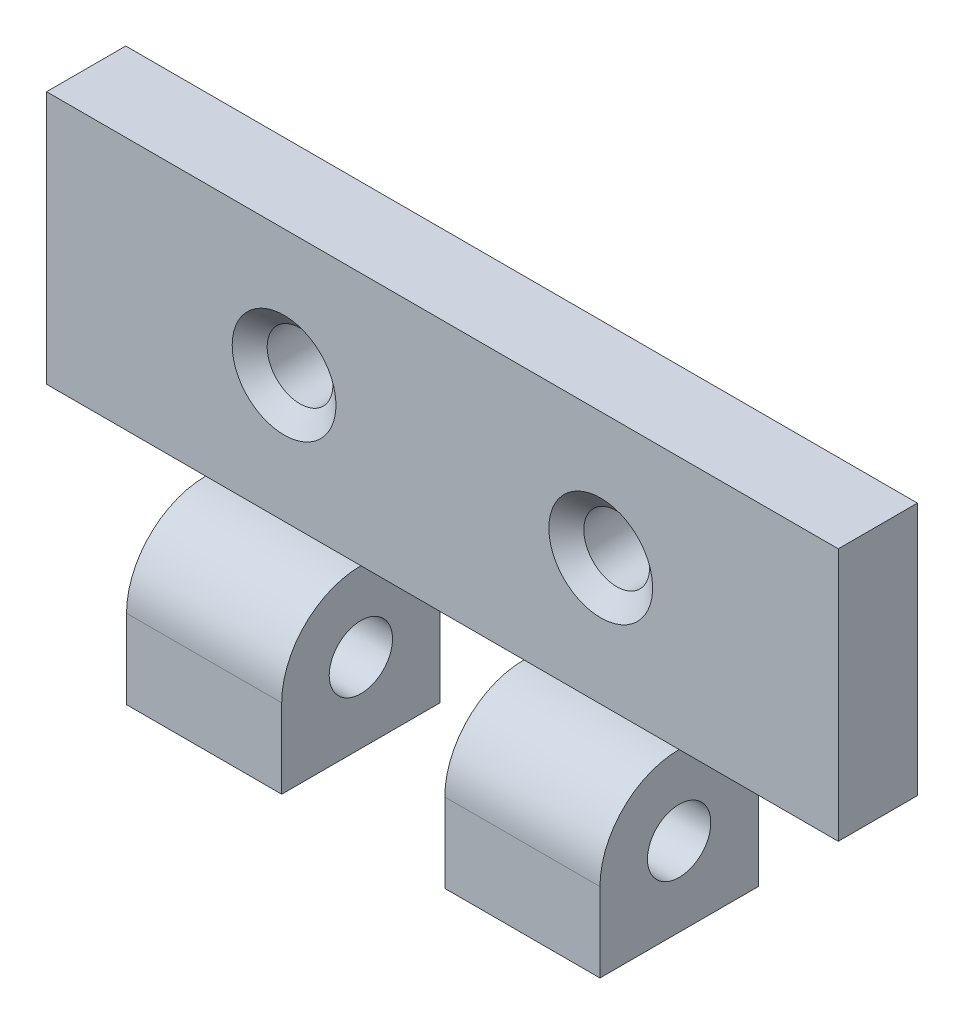
ISO-10303-21;
HEADER;
FILE_DESCRIPTION(('STEP AP214'),'2;1');
FILE_NAME('part.step','',(''),(''),'','','');
FILE_SCHEMA(('AUTOMOTIVE_DESIGN { 1 0 10303 214 1 1 1 1 }'));
ENDSEC;
DATA;
#1=APPLICATION_CONTEXT('core data for automotive mechanical design processes');
#2=APPLICATION_PROTOCOL_DEFINITION('international standard','automotive_design',2000,#1);
#3=PRODUCT_CONTEXT('',#1,'mechanical');
#4=PRODUCT('Part','Part','',(#3));
#5=PRODUCT_RELATED_PRODUCT_CATEGORY('part','',(#4));
#6=PRODUCT_DEFINITION_FORMATION('','',#4);
#7=PRODUCT_DEFINITION_CONTEXT('part definition',#1,'design');
#8=PRODUCT_DEFINITION('design','',#6,#7);
#9=PRODUCT_DEFINITION_SHAPE('','',#8);
#10=(LENGTH_UNIT() NAMED_UNIT(*) SI_UNIT(.MILLI.,.METRE.));
#11=(NAMED_UNIT(*) PLANE_ANGLE_UNIT() SI_UNIT($,.RADIAN.));
#12=(NAMED_UNIT(*) SI_UNIT($,.STERADIAN.) SOLID_ANGLE_UNIT());
#13=UNCERTAINTY_MEASURE_WITH_UNIT(LENGTH_MEASURE(1.E-05),#10,'distance_accuracy_value','');
#14=(GEOMETRIC_REPRESENTATION_CONTEXT(3) GLOBAL_UNCERTAINTY_ASSIGNED_CONTEXT((#13)) GLOBAL_UNIT_ASSIGNED_CONTEXT((#10,
#11,#12)) REPRESENTATION_CONTEXT('',''));
#15=CARTESIAN_POINT('',(0.,0.,0.));
#16=DIRECTION('',(0.,0.,1.));
#17=DIRECTION('',(1.,0.,0.));
#18=AXIS2_PLACEMENT_3D('',#15,#16,#17);
#19=CARTESIAN_POINT('',(-114.95,0.,-190.));
#20=DIRECTION('',(1.,0.,0.));
#21=DIRECTION('',(0.,0.,-1.));
#22=AXIS2_PLACEMENT_3D('',#19,#20,#21);
#23=PLANE('',#22);
#24=CARTESIAN_POINT('',(-114.95,5.,-195.));
#25=DIRECTION('',(-1.,0.,0.));
#26=DIRECTION('',(0.,0.,1.));
#27=AXIS2_PLACEMENT_3D('',#24,#25,#26);
#28=CIRCLE('',#27,2.);
#29=CARTESIAN_POINT('',(-114.95,5.,-193.));
#30=VERTEX_POINT('',#29);
#31=EDGE_CURVE('E208',#30,#30,#28,.T.);
#32=ORIENTED_EDGE('',*,*,#31,.F.);
#33=EDGE_LOOP('',(#32));
#34=FACE_BOUND('',#33,.T.);
#35=DIRECTION('',(0.,-1.,0.));
#36=VECTOR('',#35,1.);
#37=CARTESIAN_POINT('',(-114.95,0.,-190.));
#38=LINE('',#37,#36);
#39=CARTESIAN_POINT('',(-114.95,5.00000000000002,-190.));
#40=VERTEX_POINT('',#39);
#41=CARTESIAN_POINT('',(-114.95,0.,-190.));
#42=VERTEX_POINT('',#41);
#43=EDGE_CURVE('E119',#40,#42,#38,.T.);
#44=ORIENTED_EDGE('',*,*,#43,.F.);
#45=CARTESIAN_POINT('',(-114.95,5.,-195.));
#46=DIRECTION('',(1.,0.,0.));
#47=DIRECTION('',(0.,0.,-1.));
#48=AXIS2_PLACEMENT_3D('',#45,#46,#47);
#49=CIRCLE('',#48,5.);
#50=CARTESIAN_POINT('',(-114.95,9.99999999999999,-195.));
#51=VERTEX_POINT('',#50);
#52=EDGE_CURVE('E57',#40,#51,#49,.F.);
#53=ORIENTED_EDGE('',*,*,#52,.T.);
#54=DIRECTION('',(0.,0.,-1.));
#55=VECTOR('',#54,1.);
#56=CARTESIAN_POINT('',(-114.95,10.,-190.));
#57=LINE('',#56,#55);
#58=CARTESIAN_POINT('',(-114.95,10.,-200.));
#59=VERTEX_POINT('',#58);
#60=EDGE_CURVE('E201',#51,#59,#57,.T.);
#61=ORIENTED_EDGE('',*,*,#60,.T.);
#62=DIRECTION('',(0.,-1.,0.));
#63=VECTOR('',#62,1.);
#64=CARTESIAN_POINT('',(-114.95,0.,-200.));
#65=LINE('',#64,#63);
#66=CARTESIAN_POINT('',(-114.95,0.,-200.));
#67=VERTEX_POINT('',#66);
#68=EDGE_CURVE('E263',#59,#67,#65,.T.);
#69=ORIENTED_EDGE('',*,*,#68,.T.);
#70=DIRECTION('',(0.,0.,-1.));
#71=VECTOR('',#70,1.);
#72=CARTESIAN_POINT('',(-114.95,0.,-190.));
#73=LINE('',#72,#71);
#74=EDGE_CURVE('E198',#42,#67,#73,.T.);
#75=ORIENTED_EDGE('',*,*,#74,.F.);
#76=EDGE_LOOP('',(#44,#53,#61,#69,#75));
#77=FACE_BOUND('',#76,.T.);
#78=ADVANCED_FACE('F41',(#34,#77),#23,.F.);
#79=CARTESIAN_POINT('',(-105.15,10.,-190.));
#80=DIRECTION('',(-1.,0.,0.));
#81=DIRECTION('',(0.,0.,1.));
#82=AXIS2_PLACEMENT_3D('',#79,#80,#81);
#83=PLANE('',#82);
#84=CARTESIAN_POINT('',(-105.15,5.,-195.));
#85=DIRECTION('',(-1.,0.,0.));
#86=DIRECTION('',(0.,0.,1.));
#87=AXIS2_PLACEMENT_3D('',#84,#85,#86);
#88=CIRCLE('',#87,2.);
#89=CARTESIAN_POINT('',(-105.15,5.,-193.));
#90=VERTEX_POINT('',#89);
#91=EDGE_CURVE('E247',#90,#90,#88,.T.);
#92=ORIENTED_EDGE('',*,*,#91,.T.);
#93=EDGE_LOOP('',(#92));
#94=FACE_BOUND('',#93,.T.);
#95=DIRECTION('',(0.,0.,-1.));
#96=VECTOR('',#95,1.);
#97=CARTESIAN_POINT('',(-105.15,10.,-190.));
#98=LINE('',#97,#96);
#99=CARTESIAN_POINT('',(-105.15,10.,-195.));
#100=VERTEX_POINT('',#99);
#101=CARTESIAN_POINT('',(-105.15,10.,-200.));
#102=VERTEX_POINT('',#101);
#103=EDGE_CURVE('E193',#100,#102,#98,.T.);
#104=ORIENTED_EDGE('',*,*,#103,.F.);
#105=CARTESIAN_POINT('',(-105.15,5.00000000000002,-195.));
#106=DIRECTION('',(-1.,0.,0.));
#107=DIRECTION('',(0.,0.,1.));
#108=AXIS2_PLACEMENT_3D('',#105,#106,#107);
#109=CIRCLE('',#108,5.);
#110=CARTESIAN_POINT('',(-105.15,5.00000000000002,-190.));
#111=VERTEX_POINT('',#110);
#112=EDGE_CURVE('E294',#100,#111,#109,.F.);
#113=ORIENTED_EDGE('',*,*,#112,.T.);
#114=DIRECTION('',(0.,1.,0.));
#115=VECTOR('',#114,1.);
#116=CARTESIAN_POINT('',(-105.15,10.,-190.));
#117=LINE('',#116,#115);
#118=CARTESIAN_POINT('',(-105.15,0.,-190.));
#119=VERTEX_POINT('',#118);
#120=EDGE_CURVE('E255',#119,#111,#117,.T.);
#121=ORIENTED_EDGE('',*,*,#120,.F.);
#122=DIRECTION('',(0.,0.,-1.));
#123=VECTOR('',#122,1.);
#124=CARTESIAN_POINT('',(-105.15,0.,-190.));
#125=LINE('',#124,#123);
#126=CARTESIAN_POINT('',(-105.15,0.,-200.));
#127=VERTEX_POINT('',#126);
#128=EDGE_CURVE('E195',#119,#127,#125,.T.);
#129=ORIENTED_EDGE('',*,*,#128,.T.);
#130=DIRECTION('',(0.,1.,0.));
#131=VECTOR('',#130,1.);
#132=CARTESIAN_POINT('',(-105.15,10.,-200.));
#133=LINE('',#132,#131);
#134=EDGE_CURVE('E267',#127,#102,#133,.T.);
#135=ORIENTED_EDGE('',*,*,#134,.T.);
#136=EDGE_LOOP('',(#104,#113,#121,#129,#135));
#137=FACE_BOUND('',#136,.T.);
#138=ADVANCED_FACE('F323',(#94,#137),#83,.F.);
#139=CARTESIAN_POINT('',(-94.8499999999999,0.,-190.));
#140=DIRECTION('',(1.,0.,0.));
#141=DIRECTION('',(0.,0.,-1.));
#142=AXIS2_PLACEMENT_3D('',#139,#140,#141);
#143=PLANE('',#142);
#144=CARTESIAN_POINT('',(-94.8499999999999,5.,-195.));
#145=DIRECTION('',(1.,0.,0.));
#146=DIRECTION('',(0.,0.,-1.));
#147=AXIS2_PLACEMENT_3D('',#144,#145,#146);
#148=CIRCLE('',#147,2.);
#149=CARTESIAN_POINT('',(-94.8499999999999,5.,-197.));
#150=VERTEX_POINT('',#149);
#151=EDGE_CURVE('E207',#150,#150,#148,.T.);
#152=ORIENTED_EDGE('',*,*,#151,.T.);
#153=EDGE_LOOP('',(#152));
#154=FACE_BOUND('',#153,.T.);
#155=DIRECTION('',(0.,-1.,0.));
#156=VECTOR('',#155,1.);
#157=CARTESIAN_POINT('',(-94.8499999999999,0.,-190.));
#158=LINE('',#157,#156);
#159=CARTESIAN_POINT('',(-94.8499999999999,5.00000000000003,-190.));
#160=VERTEX_POINT('',#159);
#161=CARTESIAN_POINT('',(-94.8499999999999,0.,-190.));
#162=VERTEX_POINT('',#161);
#163=EDGE_CURVE('E258',#160,#162,#158,.T.);
#164=ORIENTED_EDGE('',*,*,#163,.F.);
#165=CARTESIAN_POINT('',(-94.8499999999999,5.00000000000003,-195.));
#166=DIRECTION('',(1.,0.,0.));
#167=DIRECTION('',(0.,0.,-1.));
#168=AXIS2_PLACEMENT_3D('',#165,#166,#167);
#169=CIRCLE('',#168,5.);
#170=CARTESIAN_POINT('',(-94.8499999999999,10.,-195.));
#171=VERTEX_POINT('',#170);
#172=EDGE_CURVE('E296',#160,#171,#169,.F.);
#173=ORIENTED_EDGE('',*,*,#172,.T.);
#174=DIRECTION('',(0.,0.,-1.));
#175=VECTOR('',#174,1.);
#176=CARTESIAN_POINT('',(-94.8499999999999,10.,-190.));
#177=LINE('',#176,#175);
#178=CARTESIAN_POINT('',(-94.8499999999999,10.,-200.));
#179=VERTEX_POINT('',#178);
#180=EDGE_CURVE('E191',#171,#179,#177,.T.);
#181=ORIENTED_EDGE('',*,*,#180,.T.);
#182=DIRECTION('',(0.,-1.,0.));
#183=VECTOR('',#182,1.);
#184=CARTESIAN_POINT('',(-94.8499999999999,0.,-200.));
#185=LINE('',#184,#183);
#186=CARTESIAN_POINT('',(-94.8499999999999,0.,-200.));
#187=VERTEX_POINT('',#186);
#188=EDGE_CURVE('E273',#179,#187,#185,.T.);
#189=ORIENTED_EDGE('',*,*,#188,.T.);
#190=DIRECTION('',(0.,0.,-1.));
#191=VECTOR('',#190,1.);
#192=CARTESIAN_POINT('',(-94.8499999999999,0.,-190.));
#193=LINE('',#192,#191);
#194=EDGE_CURVE('E188',#162,#187,#193,.T.);
#195=ORIENTED_EDGE('',*,*,#194,.F.);
#196=EDGE_LOOP('',(#164,#173,#181,#189,#195));
#197=FACE_BOUND('',#196,.T.);
#198=ADVANCED_FACE('F333',(#154,#197),#143,.F.);
#199=CARTESIAN_POINT('',(-85.0499999999999,10.,-190.));
#200=DIRECTION('',(-1.,0.,0.));
#201=DIRECTION('',(0.,0.,1.));
#202=AXIS2_PLACEMENT_3D('',#199,#200,#201);
#203=PLANE('',#202);
#204=CARTESIAN_POINT('',(-85.0499999999999,5.,-195.));
#205=DIRECTION('',(-1.,0.,0.));
#206=DIRECTION('',(0.,0.,1.));
#207=AXIS2_PLACEMENT_3D('',#204,#205,#206);
#208=CIRCLE('',#207,2.);
#209=CARTESIAN_POINT('',(-85.0499999999999,5.,-193.));
#210=VERTEX_POINT('',#209);
#211=EDGE_CURVE('E204',#210,#210,#208,.T.);
#212=ORIENTED_EDGE('',*,*,#211,.T.);
#213=EDGE_LOOP('',(#212));
#214=FACE_BOUND('',#213,.T.);
#215=DIRECTION('',(0.,0.,-1.));
#216=VECTOR('',#215,1.);
#217=CARTESIAN_POINT('',(-85.0499999999999,10.,-190.));
#218=LINE('',#217,#216);
#219=CARTESIAN_POINT('',(-85.0499999999999,10.,-195.));
#220=VERTEX_POINT('',#219);
#221=CARTESIAN_POINT('',(-85.0499999999999,10.,-200.));
#222=VERTEX_POINT('',#221);
#223=EDGE_CURVE('E183',#220,#222,#218,.T.);
#224=ORIENTED_EDGE('',*,*,#223,.F.);
#225=CARTESIAN_POINT('',(-85.0499999999999,5.00000000000005,-195.));
#226=DIRECTION('',(-1.,0.,0.));
#227=DIRECTION('',(0.,0.,1.));
#228=AXIS2_PLACEMENT_3D('',#225,#226,#227);
#229=CIRCLE('',#228,5.);
#230=CARTESIAN_POINT('',(-85.0499999999999,5.00000000000005,-190.));
#231=VERTEX_POINT('',#230);
#232=EDGE_CURVE('E301',#220,#231,#229,.F.);
#233=ORIENTED_EDGE('',*,*,#232,.T.);
#234=DIRECTION('',(0.,1.,0.));
#235=VECTOR('',#234,1.);
#236=CARTESIAN_POINT('',(-85.0499999999999,10.,-190.));
#237=LINE('',#236,#235);
#238=CARTESIAN_POINT('',(-85.0499999999999,0.,-190.));
#239=VERTEX_POINT('',#238);
#240=EDGE_CURVE('E178',#239,#231,#237,.T.);
#241=ORIENTED_EDGE('',*,*,#240,.F.);
#242=DIRECTION('',(0.,0.,-1.));
#243=VECTOR('',#242,1.);
#244=CARTESIAN_POINT('',(-85.0499999999999,0.,-190.));
#245=LINE('',#244,#243);
#246=CARTESIAN_POINT('',(-85.0499999999999,0.,-200.));
#247=VERTEX_POINT('',#246);
#248=EDGE_CURVE('E185',#239,#247,#245,.T.);
#249=ORIENTED_EDGE('',*,*,#248,.T.);
#250=DIRECTION('',(0.,1.,0.));
#251=VECTOR('',#250,1.);
#252=CARTESIAN_POINT('',(-85.0499999999999,10.,-200.));
#253=LINE('',#252,#251);
#254=EDGE_CURVE('E277',#247,#222,#253,.T.);
#255=ORIENTED_EDGE('',*,*,#254,.T.);
#256=EDGE_LOOP('',(#224,#233,#241,#249,#255));
#257=FACE_BOUND('',#256,.T.);
#258=ADVANCED_FACE('F338',(#214,#257),#203,.F.);
#259=CARTESIAN_POINT('',(0.,0.,-190.));
#260=DIRECTION('',(0.,0.,-1.));
#261=DIRECTION('',(-1.,0.,0.));
#262=AXIS2_PLACEMENT_3D('',#259,#260,#261);
#263=PLANE('',#262);
#264=ORIENTED_EDGE('',*,*,#240,.T.);
#265=DIRECTION('',(-1.,0.,0.));
#266=VECTOR('',#265,1.);
#267=CARTESIAN_POINT('',(0.,5.0000000000002,-190.));
#268=LINE('',#267,#266);
#269=EDGE_CURVE('E210',#231,#160,#268,.T.);
#270=ORIENTED_EDGE('',*,*,#269,.T.);
#271=ORIENTED_EDGE('',*,*,#163,.T.);
#272=DIRECTION('',(1.,0.,0.));
#273=VECTOR('',#272,1.);
#274=CARTESIAN_POINT('',(-85.0499999999999,0.,-190.));
#275=LINE('',#274,#273);
#276=EDGE_CURVE('E66',#162,#239,#275,.T.);
#277=ORIENTED_EDGE('',*,*,#276,.T.);
#278=EDGE_LOOP('',(#264,#270,#271,#277));
#279=FACE_BOUND('',#278,.T.);
#280=ADVANCED_FACE('F340',(#279),#263,.F.);
#281=CARTESIAN_POINT('',(-114.95,10.,-190.));
#282=DIRECTION('',(0.,1.,0.));
#283=DIRECTION('',(0.,0.,1.));
#284=AXIS2_PLACEMENT_3D('',#281,#282,#283);
#285=PLANE('',#284);
#286=ORIENTED_EDGE('',*,*,#60,.F.);
#287=DIRECTION('',(-1.,0.,0.));
#288=VECTOR('',#287,1.);
#289=CARTESIAN_POINT('',(-71.,10.0000000000001,-195.));
#290=LINE('',#289,#288);
#291=CARTESIAN_POINT('',(-125.,9.99999999999997,-195.));
#292=VERTEX_POINT('',#291);
#293=EDGE_CURVE('E163',#51,#292,#290,.T.);
#294=ORIENTED_EDGE('',*,*,#293,.T.);
#295=DIRECTION('',(0.,0.,-1.));
#296=VECTOR('',#295,1.);
#297=CARTESIAN_POINT('',(-125.,10.,-190.));
#298=LINE('',#297,#296);
#299=CARTESIAN_POINT('',(-125.,10.,-200.));
#300=VERTEX_POINT('',#299);
#301=EDGE_CURVE('E112',#292,#300,#298,.T.);
#302=ORIENTED_EDGE('',*,*,#301,.T.);
#303=DIRECTION('',(1.,0.,0.));
#304=VECTOR('',#303,1.);
#305=CARTESIAN_POINT('',(-114.95,10.,-200.));
#306=LINE('',#305,#304);
#307=EDGE_CURVE('E250',#300,#59,#306,.T.);
#308=ORIENTED_EDGE('',*,*,#307,.T.);
#309=EDGE_LOOP('',(#286,#294,#302,#308));
#310=FACE_BOUND('',#309,.T.);
#311=ADVANCED_FACE('F292',(#310),#285,.F.);
#312=CARTESIAN_POINT('',(-105.15,0.,-190.));
#313=DIRECTION('',(0.,1.,0.));
#314=DIRECTION('',(-1.,0.,0.));
#315=AXIS2_PLACEMENT_3D('',#312,#313,#314);
#316=PLANE('',#315);
#317=DIRECTION('',(1.,0.,0.));
#318=VECTOR('',#317,1.);
#319=CARTESIAN_POINT('',(-105.15,0.,-200.));
#320=LINE('',#319,#318);
#321=EDGE_CURVE('E265',#67,#127,#320,.T.);
#322=ORIENTED_EDGE('',*,*,#321,.T.);
#323=ORIENTED_EDGE('',*,*,#128,.F.);
#324=DIRECTION('',(1.,0.,0.));
#325=VECTOR('',#324,1.);
#326=CARTESIAN_POINT('',(-105.15,0.,-190.));
#327=LINE('',#326,#325);
#328=EDGE_CURVE('E252',#42,#119,#327,.T.);
#329=ORIENTED_EDGE('',*,*,#328,.F.);
#330=ORIENTED_EDGE('',*,*,#74,.T.);
#331=EDGE_LOOP('',(#322,#323,#329,#330));
#332=FACE_BOUND('',#331,.T.);
#333=ADVANCED_FACE('F363',(#332),#316,.F.);
#334=CARTESIAN_POINT('',(-94.8499999999999,10.,-190.));
#335=DIRECTION('',(0.,1.,0.));
#336=DIRECTION('',(0.,0.,1.));
#337=AXIS2_PLACEMENT_3D('',#334,#335,#336);
#338=PLANE('',#337);
#339=ORIENTED_EDGE('',*,*,#180,.F.);
#340=EDGE_CURVE('E309',#171,#100,#290,.T.);
#341=ORIENTED_EDGE('',*,*,#340,.T.);
#342=ORIENTED_EDGE('',*,*,#103,.T.);
#343=DIRECTION('',(1.,0.,0.));
#344=VECTOR('',#343,1.);
#345=CARTESIAN_POINT('',(-94.8499999999999,10.,-200.));
#346=LINE('',#345,#344);
#347=EDGE_CURVE('E270',#102,#179,#346,.T.);
#348=ORIENTED_EDGE('',*,*,#347,.T.);
#349=EDGE_LOOP('',(#339,#341,#342,#348));
#350=FACE_BOUND('',#349,.T.);
#351=ADVANCED_FACE('F321',(#350),#338,.F.);
#352=CARTESIAN_POINT('',(-85.0499999999999,0.,-190.));
#353=DIRECTION('',(0.,1.,0.));
#354=DIRECTION('',(-1.,0.,0.));
#355=AXIS2_PLACEMENT_3D('',#352,#353,#354);
#356=PLANE('',#355);
#357=DIRECTION('',(1.,0.,0.));
#358=VECTOR('',#357,1.);
#359=CARTESIAN_POINT('',(-85.0499999999999,0.,-200.));
#360=LINE('',#359,#358);
#361=EDGE_CURVE('E275',#187,#247,#360,.T.);
#362=ORIENTED_EDGE('',*,*,#361,.T.);
#363=ORIENTED_EDGE('',*,*,#248,.F.);
#364=ORIENTED_EDGE('',*,*,#276,.F.);
#365=ORIENTED_EDGE('',*,*,#194,.T.);
#366=EDGE_LOOP('',(#362,#363,#364,#365));
#367=FACE_BOUND('',#366,.T.);
#368=ADVANCED_FACE('F335',(#367),#356,.F.);
#369=CARTESIAN_POINT('',(-74.9999999999999,10.,-190.));
#370=DIRECTION('',(0.,1.,0.));
#371=DIRECTION('',(0.,0.,1.));
#372=AXIS2_PLACEMENT_3D('',#369,#370,#371);
#373=PLANE('',#372);
#374=DIRECTION('',(0.,0.,-1.));
#375=VECTOR('',#374,1.);
#376=CARTESIAN_POINT('',(-74.9999999999999,10.,-190.));
#377=LINE('',#376,#375);
#378=CARTESIAN_POINT('',(-74.9999999999999,10.0000000000001,-195.));
#379=VERTEX_POINT('',#378);
#380=CARTESIAN_POINT('',(-74.9999999999999,10.,-200.));
#381=VERTEX_POINT('',#380);
#382=EDGE_CURVE('E176',#379,#381,#377,.T.);
#383=ORIENTED_EDGE('',*,*,#382,.F.);
#384=EDGE_CURVE('E306',#379,#220,#290,.T.);
#385=ORIENTED_EDGE('',*,*,#384,.T.);
#386=ORIENTED_EDGE('',*,*,#223,.T.);
#387=DIRECTION('',(1.,0.,0.));
#388=VECTOR('',#387,1.);
#389=CARTESIAN_POINT('',(-74.9999999999999,10.,-200.));
#390=LINE('',#389,#388);
#391=EDGE_CURVE('E280',#222,#381,#390,.T.);
#392=ORIENTED_EDGE('',*,*,#391,.T.);
#393=EDGE_LOOP('',(#383,#385,#386,#392));
#394=FACE_BOUND('',#393,.T.);
#395=ADVANCED_FACE('F404',(#394),#373,.F.);
#396=CARTESIAN_POINT('',(-74.9999999999999,10.,-190.));
#397=DIRECTION('',(-1.,0.,0.));
#398=DIRECTION('',(0.,-1.,0.));
#399=AXIS2_PLACEMENT_3D('',#396,#397,#398);
#400=PLANE('',#399);
#401=DIRECTION('',(0.,0.,-1.));
#402=VECTOR('',#401,1.);
#403=CARTESIAN_POINT('',(-75.,26.,-190.));
#404=LINE('',#403,#402);
#405=CARTESIAN_POINT('',(-75.,26.0000000000001,-195.));
#406=VERTEX_POINT('',#405);
#407=CARTESIAN_POINT('',(-75.,26.,-200.));
#408=VERTEX_POINT('',#407);
#409=EDGE_CURVE('E174',#406,#408,#404,.T.);
#410=ORIENTED_EDGE('',*,*,#409,.F.);
#411=DIRECTION('',(0.,-1.,0.));
#412=VECTOR('',#411,1.);
#413=CARTESIAN_POINT('',(-74.9999999999999,10.,-195.));
#414=LINE('',#413,#412);
#415=EDGE_CURVE('E159',#406,#379,#414,.T.);
#416=ORIENTED_EDGE('',*,*,#415,.T.);
#417=ORIENTED_EDGE('',*,*,#382,.T.);
#418=DIRECTION('',(0.,1.,0.));
#419=VECTOR('',#418,1.);
#420=CARTESIAN_POINT('',(-74.9999999999999,10.,-200.));
#421=LINE('',#420,#419);
#422=EDGE_CURVE('E283',#381,#408,#421,.T.);
#423=ORIENTED_EDGE('',*,*,#422,.T.);
#424=EDGE_LOOP('',(#410,#416,#417,#423));
#425=FACE_BOUND('',#424,.T.);
#426=ADVANCED_FACE('F399',(#425),#400,.F.);
#427=CARTESIAN_POINT('',(-125.,26.,-190.));
#428=DIRECTION('',(0.,-1.,0.));
#429=DIRECTION('',(0.,0.,-1.));
#430=AXIS2_PLACEMENT_3D('',#427,#428,#429);
#431=PLANE('',#430);
#432=DIRECTION('',(0.,0.,-1.));
#433=VECTOR('',#432,1.);
#434=CARTESIAN_POINT('',(-125.,26.,-190.));
#435=LINE('',#434,#433);
#436=CARTESIAN_POINT('',(-125.,26.,-195.));
#437=VERTEX_POINT('',#436);
#438=CARTESIAN_POINT('',(-125.,26.,-200.));
#439=VERTEX_POINT('',#438);
#440=EDGE_CURVE('E167',#437,#439,#435,.T.);
#441=ORIENTED_EDGE('',*,*,#440,.F.);
#442=DIRECTION('',(-1.,0.,0.));
#443=VECTOR('',#442,1.);
#444=CARTESIAN_POINT('',(-71.,26.0000000000001,-195.));
#445=LINE('',#444,#443);
#446=EDGE_CURVE('E154',#406,#437,#445,.T.);
#447=ORIENTED_EDGE('',*,*,#446,.F.);
#448=ORIENTED_EDGE('',*,*,#409,.T.);
#449=DIRECTION('',(-1.,0.,0.));
#450=VECTOR('',#449,1.);
#451=CARTESIAN_POINT('',(-125.,26.,-200.));
#452=LINE('',#451,#450);
#453=EDGE_CURVE('E172',#408,#439,#452,.T.);
#454=ORIENTED_EDGE('',*,*,#453,.T.);
#455=EDGE_LOOP('',(#441,#447,#448,#454));
#456=FACE_BOUND('',#455,.T.);
#457=ADVANCED_FACE('F170',(#456),#431,.F.);
#458=CARTESIAN_POINT('',(-125.,10.,-190.));
#459=DIRECTION('',(1.,0.,0.));
#460=DIRECTION('',(0.,1.,0.));
#461=AXIS2_PLACEMENT_3D('',#458,#459,#460);
#462=PLANE('',#461);
#463=ORIENTED_EDGE('',*,*,#301,.F.);
#464=DIRECTION('',(0.,-1.,0.));
#465=VECTOR('',#464,1.);
#466=CARTESIAN_POINT('',(-125.,9.99999999999997,-195.));
#467=LINE('',#466,#465);
#468=EDGE_CURVE('E157',#437,#292,#467,.T.);
#469=ORIENTED_EDGE('',*,*,#468,.F.);
#470=ORIENTED_EDGE('',*,*,#440,.T.);
#471=DIRECTION('',(0.,-1.,0.));
#472=VECTOR('',#471,1.);
#473=CARTESIAN_POINT('',(-125.,10.,-200.));
#474=LINE('',#473,#472);
#475=EDGE_CURVE('E253',#439,#300,#474,.T.);
#476=ORIENTED_EDGE('',*,*,#475,.T.);
#477=EDGE_LOOP('',(#463,#469,#470,#476));
#478=FACE_BOUND('',#477,.T.);
#479=ADVANCED_FACE('F166',(#478),#462,.F.);
#480=ORIENTED_EDGE('',*,*,#120,.T.);
#481=EDGE_CURVE('E203',#111,#40,#268,.T.);
#482=ORIENTED_EDGE('',*,*,#481,.T.);
#483=ORIENTED_EDGE('',*,*,#43,.T.);
#484=ORIENTED_EDGE('',*,*,#328,.T.);
#485=EDGE_LOOP('',(#480,#482,#483,#484));
#486=FACE_BOUND('',#485,.T.);
#487=ADVANCED_FACE('F377',(#486),#263,.F.);
#488=CARTESIAN_POINT('',(0.,0.,-200.));
#489=DIRECTION('',(0.,0.,-1.));
#490=DIRECTION('',(-1.,0.,0.));
#491=AXIS2_PLACEMENT_3D('',#488,#489,#490);
#492=PLANE('',#491);
#493=CARTESIAN_POINT('',(-89.9999999999999,18.,-200.));
#494=DIRECTION('',(0.,0.,-1.));
#495=DIRECTION('',(-1.,0.,0.));
#496=AXIS2_PLACEMENT_3D('',#493,#494,#495);
#497=CIRCLE('',#496,2.07645);
#498=CARTESIAN_POINT('',(-92.0764499999999,18.,-200.));
#499=VERTEX_POINT('',#498);
#500=EDGE_CURVE('E234',#499,#499,#497,.T.);
#501=ORIENTED_EDGE('',*,*,#500,.F.);
#502=EDGE_LOOP('',(#501));
#503=FACE_BOUND('',#502,.T.);
#504=CARTESIAN_POINT('',(-110.,18.,-200.));
#505=DIRECTION('',(0.,0.,-1.));
#506=DIRECTION('',(-1.,0.,0.));
#507=AXIS2_PLACEMENT_3D('',#504,#505,#506);
#508=CIRCLE('',#507,2.07645);
#509=CARTESIAN_POINT('',(-112.07645,18.,-200.));
#510=VERTEX_POINT('',#509);
#511=EDGE_CURVE('E236',#510,#510,#508,.T.);
#512=ORIENTED_EDGE('',*,*,#511,.F.);
#513=EDGE_LOOP('',(#512));
#514=FACE_BOUND('',#513,.T.);
#515=ORIENTED_EDGE('',*,*,#307,.F.);
#516=ORIENTED_EDGE('',*,*,#475,.F.);
#517=ORIENTED_EDGE('',*,*,#453,.F.);
#518=ORIENTED_EDGE('',*,*,#422,.F.);
#519=ORIENTED_EDGE('',*,*,#391,.F.);
#520=ORIENTED_EDGE('',*,*,#254,.F.);
#521=ORIENTED_EDGE('',*,*,#361,.F.);
#522=ORIENTED_EDGE('',*,*,#188,.F.);
#523=ORIENTED_EDGE('',*,*,#347,.F.);
#524=ORIENTED_EDGE('',*,*,#134,.F.);
#525=ORIENTED_EDGE('',*,*,#321,.F.);
#526=ORIENTED_EDGE('',*,*,#68,.F.);
#527=EDGE_LOOP('',(#515,#516,#517,#518,#519,#520,#521,#522,#523,#524,#525,#526));
#528=FACE_BOUND('',#527,.T.);
#529=ADVANCED_FACE('F289',(#503,#514,#528),#492,.T.);
#530=CARTESIAN_POINT('',(-71.,5.,-195.));
#531=DIRECTION('',(-1.,0.,0.));
#532=DIRECTION('',(0.,0.,1.));
#533=AXIS2_PLACEMENT_3D('',#530,#531,#532);
#534=CYLINDRICAL_SURFACE('',#533,2.);
#535=ORIENTED_EDGE('',*,*,#211,.F.);
#536=EDGE_LOOP('',(#535));
#537=FACE_BOUND('',#536,.T.);
#538=ORIENTED_EDGE('',*,*,#151,.F.);
#539=EDGE_LOOP('',(#538));
#540=FACE_BOUND('',#539,.T.);
#541=ADVANCED_FACE('F392',(#537,#540),#534,.F.);
#542=ORIENTED_EDGE('',*,*,#31,.T.);
#543=EDGE_LOOP('',(#542));
#544=FACE_BOUND('',#543,.T.);
#545=ORIENTED_EDGE('',*,*,#91,.F.);
#546=EDGE_LOOP('',(#545));
#547=FACE_BOUND('',#546,.T.);
#548=ADVANCED_FACE('F479',(#544,#547),#534,.F.);
#549=CARTESIAN_POINT('',(-110.,18.,-190.));
#550=DIRECTION('',(0.,0.,-1.));
#551=DIRECTION('',(-1.,0.,0.));
#552=AXIS2_PLACEMENT_3D('',#549,#550,#551);
#553=CYLINDRICAL_SURFACE('',#552,2.07645);
#554=CARTESIAN_POINT('',(-110.,18.,-196.006919557413));
#555=DIRECTION('',(0.,0.,-1.));
#556=DIRECTION('',(-1.,0.,0.));
#557=AXIS2_PLACEMENT_3D('',#554,#555,#556);
#558=CIRCLE('',#557,2.07645);
#559=CARTESIAN_POINT('',(-112.07645,18.,-196.006919557413));
#560=VERTEX_POINT('',#559);
#561=EDGE_CURVE('E11',#560,#560,#558,.F.);
#562=ORIENTED_EDGE('',*,*,#561,.T.);
#563=EDGE_LOOP('',(#562));
#564=FACE_BOUND('',#563,.T.);
#565=ORIENTED_EDGE('',*,*,#511,.T.);
#566=EDGE_LOOP('',(#565));
#567=FACE_BOUND('',#566,.T.);
#568=ADVANCED_FACE('F230',(#564,#567),#553,.F.);
#569=CARTESIAN_POINT('',(-89.9999999999999,18.,-190.));
#570=DIRECTION('',(0.,0.,-1.));
#571=DIRECTION('',(-1.,0.,0.));
#572=AXIS2_PLACEMENT_3D('',#569,#570,#571);
#573=CYLINDRICAL_SURFACE('',#572,2.07645);
#574=CARTESIAN_POINT('',(-89.9999999999999,18.,-196.006919557413));
#575=DIRECTION('',(0.,0.,-1.));
#576=DIRECTION('',(-1.,0.,0.));
#577=AXIS2_PLACEMENT_3D('',#574,#575,#576);
#578=CIRCLE('',#577,2.07645);
#579=CARTESIAN_POINT('',(-92.0764499999999,18.,-196.006919557413));
#580=VERTEX_POINT('',#579);
#581=EDGE_CURVE('E211',#580,#580,#578,.F.);
#582=ORIENTED_EDGE('',*,*,#581,.T.);
#583=EDGE_LOOP('',(#582));
#584=FACE_BOUND('',#583,.T.);
#585=ORIENTED_EDGE('',*,*,#500,.T.);
#586=EDGE_LOOP('',(#585));
#587=FACE_BOUND('',#586,.T.);
#588=ADVANCED_FACE('F226',(#584,#587),#573,.F.);
#589=CARTESIAN_POINT('',(-71.,5.00000000000008,-195.));
#590=DIRECTION('',(-1.,0.,0.));
#591=DIRECTION('',(0.,-1.,0.));
#592=AXIS2_PLACEMENT_3D('',#589,#590,#591);
#593=CYLINDRICAL_SURFACE('',#592,5.);
#594=ORIENTED_EDGE('',*,*,#481,.F.);
#595=ORIENTED_EDGE('',*,*,#112,.F.);
#596=EDGE_CURVE('E308',#100,#51,#290,.T.);
#597=ORIENTED_EDGE('',*,*,#596,.T.);
#598=ORIENTED_EDGE('',*,*,#52,.F.);
#599=EDGE_LOOP('',(#594,#595,#597,#598));
#600=FACE_BOUND('',#599,.T.);
#601=ADVANCED_FACE('F229',(#600),#593,.T.);
#602=ORIENTED_EDGE('',*,*,#269,.F.);
#603=ORIENTED_EDGE('',*,*,#232,.F.);
#604=EDGE_CURVE('E311',#220,#171,#290,.T.);
#605=ORIENTED_EDGE('',*,*,#604,.T.);
#606=ORIENTED_EDGE('',*,*,#172,.F.);
#607=EDGE_LOOP('',(#602,#603,#605,#606));
#608=FACE_BOUND('',#607,.T.);
#609=ADVANCED_FACE('F341',(#608),#593,.T.);
#610=CARTESIAN_POINT('',(-71.,10.0000000000001,-195.));
#611=DIRECTION('',(0.,0.,-1.));
#612=DIRECTION('',(-1.,0.,0.));
#613=AXIS2_PLACEMENT_3D('',#610,#611,#612);
#614=PLANE('',#613);
#615=CARTESIAN_POINT('',(-89.9999999999999,18.,-195.));
#616=DIRECTION('',(0.,0.,-1.));
#617=DIRECTION('',(-1.,0.,0.));
#618=AXIS2_PLACEMENT_3D('',#615,#616,#617);
#619=CIRCLE('',#618,3.27644999999999);
#620=CARTESIAN_POINT('',(-93.2764499999999,18.,-195.));
#621=VERTEX_POINT('',#620);
#622=EDGE_CURVE('E50',#621,#621,#619,.T.);
#623=ORIENTED_EDGE('',*,*,#622,.T.);
#624=EDGE_LOOP('',(#623));
#625=FACE_BOUND('',#624,.T.);
#626=CARTESIAN_POINT('',(-110.,18.,-195.));
#627=DIRECTION('',(0.,0.,-1.));
#628=DIRECTION('',(-1.,0.,0.));
#629=AXIS2_PLACEMENT_3D('',#626,#627,#628);
#630=CIRCLE('',#629,3.27644999999999);
#631=CARTESIAN_POINT('',(-113.27645,18.,-195.));
#632=VERTEX_POINT('',#631);
#633=EDGE_CURVE('E214',#632,#632,#630,.T.);
#634=ORIENTED_EDGE('',*,*,#633,.T.);
#635=EDGE_LOOP('',(#634));
#636=FACE_BOUND('',#635,.T.);
#637=ORIENTED_EDGE('',*,*,#446,.T.);
#638=ORIENTED_EDGE('',*,*,#468,.T.);
#639=ORIENTED_EDGE('',*,*,#293,.F.);
#640=ORIENTED_EDGE('',*,*,#596,.F.);
#641=ORIENTED_EDGE('',*,*,#340,.F.);
#642=ORIENTED_EDGE('',*,*,#604,.F.);
#643=ORIENTED_EDGE('',*,*,#384,.F.);
#644=ORIENTED_EDGE('',*,*,#415,.F.);
#645=EDGE_LOOP('',(#637,#638,#639,#640,#641,#642,#643,#644));
#646=FACE_BOUND('',#645,.T.);
#647=ADVANCED_FACE('F156',(#625,#636,#646),#614,.F.);
#648=CARTESIAN_POINT('',(-89.9999999999999,18.,-196.006919557413));
#649=DIRECTION('',(0.,0.,1.));
#650=DIRECTION('',(1.,0.,0.));
#651=AXIS2_PLACEMENT_3D('',#648,#649,#650);
#652=CONICAL_SURFACE('',#651,2.07645,0.872664625997167);
#653=ORIENTED_EDGE('',*,*,#622,.F.);
#654=EDGE_LOOP('',(#653));
#655=FACE_BOUND('',#654,.T.);
#656=ORIENTED_EDGE('',*,*,#581,.F.);
#657=EDGE_LOOP('',(#656));
#658=FACE_BOUND('',#657,.T.);
#659=ADVANCED_FACE('F221',(#655,#658),#652,.F.);
#660=CARTESIAN_POINT('',(-110.,18.,-196.006919557413));
#661=DIRECTION('',(0.,0.,1.));
#662=DIRECTION('',(1.,0.,0.));
#663=AXIS2_PLACEMENT_3D('',#660,#661,#662);
#664=CONICAL_SURFACE('',#663,2.07645,0.872664625997167);
#665=ORIENTED_EDGE('',*,*,#633,.F.);
#666=EDGE_LOOP('',(#665));
#667=FACE_BOUND('',#666,.T.);
#668=ORIENTED_EDGE('',*,*,#561,.F.);
#669=EDGE_LOOP('',(#668));
#670=FACE_BOUND('',#669,.T.);
#671=ADVANCED_FACE('F44',(#667,#670),#664,.F.);
#672=CLOSED_SHELL('',(#78,#138,#198,#258,#280,#311,#333,#351,#368,#395,#426,#457,#479,#487,#529,
#541,#548,#568,#588,#601,#609,#647,#659,#671));
#673=MANIFOLD_SOLID_BREP('B2',#672);
#674=ADVANCED_BREP_SHAPE_REPRESENTATION('',(#18,#673),#14);
#675=SHAPE_DEFINITION_REPRESENTATION(#9,#674);
ENDSEC;
END-ISO-10303-21;
